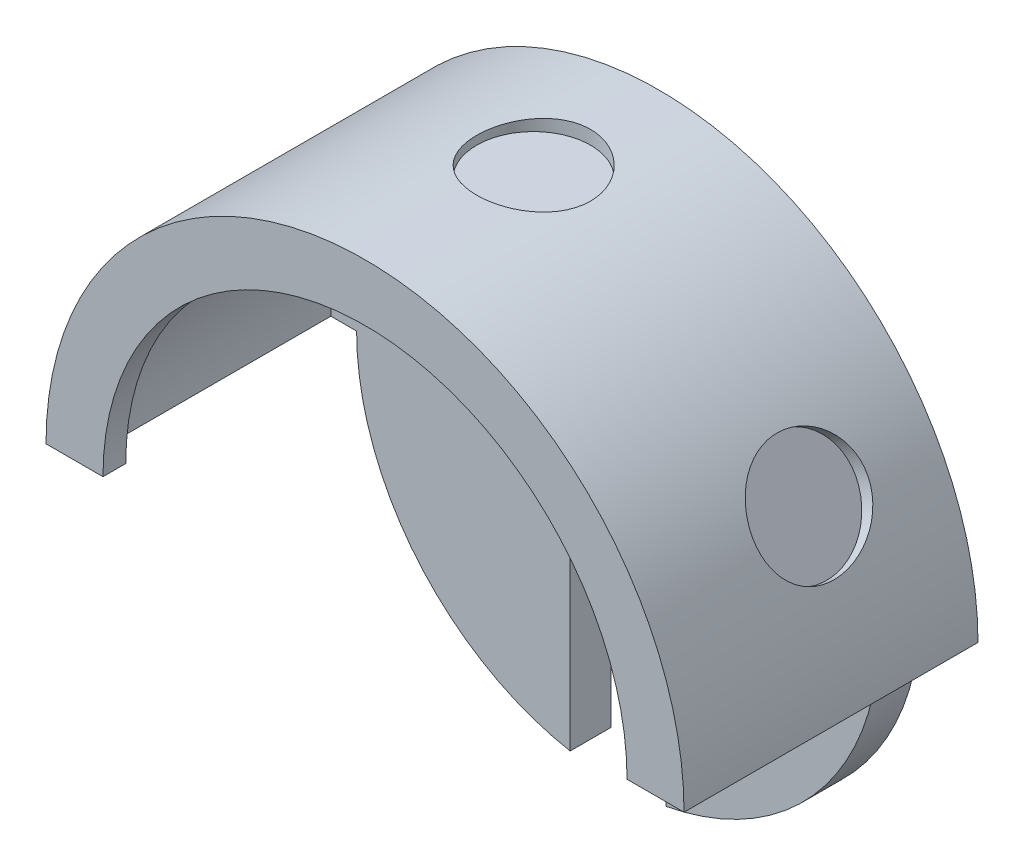
ISO-10303-21;
HEADER;
FILE_DESCRIPTION(('STEP AP214'),'2;1');
FILE_NAME('part.step','',(''),(''),'','','');
FILE_SCHEMA(('AUTOMOTIVE_DESIGN { 1 0 10303 214 1 1 1 1 }'));
ENDSEC;
DATA;
#1=APPLICATION_CONTEXT('core data for automotive mechanical design processes');
#2=APPLICATION_PROTOCOL_DEFINITION('international standard','automotive_design',2000,#1);
#3=PRODUCT_CONTEXT('',#1,'mechanical');
#4=PRODUCT('Part','Part','',(#3));
#5=PRODUCT_RELATED_PRODUCT_CATEGORY('part','',(#4));
#6=PRODUCT_DEFINITION_FORMATION('','',#4);
#7=PRODUCT_DEFINITION_CONTEXT('part definition',#1,'design');
#8=PRODUCT_DEFINITION('design','',#6,#7);
#9=PRODUCT_DEFINITION_SHAPE('','',#8);
#10=(LENGTH_UNIT() NAMED_UNIT(*) SI_UNIT(.MILLI.,.METRE.));
#11=(NAMED_UNIT(*) PLANE_ANGLE_UNIT() SI_UNIT($,.RADIAN.));
#12=(NAMED_UNIT(*) SI_UNIT($,.STERADIAN.) SOLID_ANGLE_UNIT());
#13=UNCERTAINTY_MEASURE_WITH_UNIT(LENGTH_MEASURE(1.E-05),#10,'distance_accuracy_value','');
#14=(GEOMETRIC_REPRESENTATION_CONTEXT(3) GLOBAL_UNCERTAINTY_ASSIGNED_CONTEXT((#13)) GLOBAL_UNIT_ASSIGNED_CONTEXT((#10,
#11,#12)) REPRESENTATION_CONTEXT('',''));
#15=CARTESIAN_POINT('',(0.,0.,0.));
#16=DIRECTION('',(0.,0.,1.));
#17=DIRECTION('',(1.,0.,0.));
#18=AXIS2_PLACEMENT_3D('',#15,#16,#17);
#19=CARTESIAN_POINT('',(0.,0.,12.827));
#20=DIRECTION('',(0.,0.,-1.));
#21=DIRECTION('',(-1.,0.,0.));
#22=AXIS2_PLACEMENT_3D('',#19,#20,#21);
#23=CYLINDRICAL_SURFACE('',#22,16.002);
#24=DIRECTION('',(0.,0.,1.));
#25=VECTOR('',#24,1.);
#26=CARTESIAN_POINT('',(-2.667,15.7781847815267,-2.286));
#27=LINE('',#26,#25);
#28=CARTESIAN_POINT('',(-2.667,15.7781847815267,-0.223815218473321));
#29=VERTEX_POINT('',#28);
#30=CARTESIAN_POINT('',(-2.667,15.7781847815267,0.));
#31=VERTEX_POINT('',#30);
#32=EDGE_CURVE('E243',#29,#31,#27,.T.);
#33=ORIENTED_EDGE('',*,*,#32,.F.);
#34=CARTESIAN_POINT('',(0.,0.,-16.0020000000002));
#35=DIRECTION('',(0.,0.707106781186551,-0.707106781186544));
#36=DIRECTION('',(0.,-0.707106781186544,-0.707106781186551));
#37=AXIS2_PLACEMENT_3D('',#34,#35,#36);
#38=ELLIPSE('',#37,22.6302454250944,16.002);
#39=CARTESIAN_POINT('',(2.667,15.7781847815267,-0.223815218473321));
#40=VERTEX_POINT('',#39);
#41=EDGE_CURVE('E56',#40,#29,#38,.F.);
#42=ORIENTED_EDGE('',*,*,#41,.F.);
#43=DIRECTION('',(0.,0.,1.));
#44=VECTOR('',#43,1.);
#45=CARTESIAN_POINT('',(2.667,15.7781847815267,-2.286));
#46=LINE('',#45,#44);
#47=CARTESIAN_POINT('',(2.667,15.7781847815267,0.));
#48=VERTEX_POINT('',#47);
#49=EDGE_CURVE('E250',#40,#48,#46,.T.);
#50=ORIENTED_EDGE('',*,*,#49,.T.);
#51=CARTESIAN_POINT('',(0.,0.,0.));
#52=DIRECTION('',(0.,0.,1.));
#53=DIRECTION('',(1.,0.,0.));
#54=AXIS2_PLACEMENT_3D('',#51,#52,#53);
#55=CIRCLE('',#54,16.002);
#56=CARTESIAN_POINT('',(16.002,0.,0.));
#57=VERTEX_POINT('',#56);
#58=EDGE_CURVE('E252',#57,#48,#55,.T.);
#59=ORIENTED_EDGE('',*,*,#58,.F.);
#60=DIRECTION('',(0.,0.,-1.));
#61=VECTOR('',#60,1.);
#62=CARTESIAN_POINT('',(16.002,0.,12.827));
#63=LINE('',#62,#61);
#64=CARTESIAN_POINT('',(16.002,0.,12.827));
#65=VERTEX_POINT('',#64);
#66=EDGE_CURVE('E230',#65,#57,#63,.T.);
#67=ORIENTED_EDGE('',*,*,#66,.F.);
#68=CARTESIAN_POINT('',(0.,0.,12.827));
#69=DIRECTION('',(0.,0.,1.));
#70=DIRECTION('',(1.,0.,0.));
#71=AXIS2_PLACEMENT_3D('',#68,#69,#70);
#72=CIRCLE('',#71,16.002);
#73=CARTESIAN_POINT('',(-16.002,0.,12.827));
#74=VERTEX_POINT('',#73);
#75=EDGE_CURVE('E249',#65,#74,#72,.T.);
#76=ORIENTED_EDGE('',*,*,#75,.T.);
#77=DIRECTION('',(0.,0.,-1.));
#78=VECTOR('',#77,1.);
#79=CARTESIAN_POINT('',(-16.002,0.,12.827));
#80=LINE('',#79,#78);
#81=CARTESIAN_POINT('',(-16.002,0.,0.));
#82=VERTEX_POINT('',#81);
#83=EDGE_CURVE('E227',#82,#74,#80,.F.);
#84=ORIENTED_EDGE('',*,*,#83,.F.);
#85=EDGE_CURVE('E257',#31,#82,#55,.T.);
#86=ORIENTED_EDGE('',*,*,#85,.F.);
#87=EDGE_LOOP('',(#33,#42,#50,#59,#67,#76,#84,#86));
#88=FACE_BOUND('',#87,.T.);
#89=ADVANCED_FACE('F36',(#88),#23,.F.);
#90=CARTESIAN_POINT('',(2.667,-17.5788370206905,-2.286));
#91=DIRECTION('',(-1.,0.,0.));
#92=DIRECTION('',(0.,0.,1.));
#93=AXIS2_PLACEMENT_3D('',#90,#91,#92);
#94=PLANE('',#93);
#95=DIRECTION('',(0.,0.,1.));
#96=VECTOR('',#95,1.);
#97=CARTESIAN_POINT('',(2.667,-14.3206733993203,-2.286));
#98=LINE('',#97,#96);
#99=CARTESIAN_POINT('',(2.667,-14.3206733993203,0.));
#100=VERTEX_POINT('',#99);
#101=CARTESIAN_POINT('',(2.667,-14.3206733993203,-2.286));
#102=VERTEX_POINT('',#101);
#103=EDGE_CURVE('E179',#100,#102,#98,.F.);
#104=ORIENTED_EDGE('',*,*,#103,.F.);
#105=DIRECTION('',(0.,-1.,0.));
#106=VECTOR('',#105,1.);
#107=CARTESIAN_POINT('',(2.667,-17.5788370206905,0.));
#108=LINE('',#107,#106);
#109=EDGE_CURVE('E245',#48,#100,#108,.T.);
#110=ORIENTED_EDGE('',*,*,#109,.F.);
#111=ORIENTED_EDGE('',*,*,#49,.F.);
#112=DIRECTION('',(0.,0.707106781186544,0.707106781186551));
#113=VECTOR('',#112,1.);
#114=CARTESIAN_POINT('',(2.667,16.002,0.));
#115=LINE('',#114,#113);
#116=CARTESIAN_POINT('',(2.667,13.716,-2.286));
#117=VERTEX_POINT('',#116);
#118=EDGE_CURVE('E181',#117,#40,#115,.T.);
#119=ORIENTED_EDGE('',*,*,#118,.F.);
#120=DIRECTION('',(0.,-1.,0.));
#121=VECTOR('',#120,1.);
#122=CARTESIAN_POINT('',(2.667,-17.5788370206905,-2.286));
#123=LINE('',#122,#121);
#124=EDGE_CURVE('E240',#117,#102,#123,.T.);
#125=ORIENTED_EDGE('',*,*,#124,.T.);
#126=EDGE_LOOP('',(#104,#110,#111,#119,#125));
#127=FACE_BOUND('',#126,.T.);
#128=ADVANCED_FACE('F285',(#127),#94,.T.);
#129=CARTESIAN_POINT('',(-2.667,-17.5788370206905,-2.286));
#130=DIRECTION('',(1.,0.,0.));
#131=DIRECTION('',(0.,0.,-1.));
#132=AXIS2_PLACEMENT_3D('',#129,#130,#131);
#133=PLANE('',#132);
#134=DIRECTION('',(0.,0.,1.));
#135=VECTOR('',#134,1.);
#136=CARTESIAN_POINT('',(-2.667,-14.3206733993203,-2.286));
#137=LINE('',#136,#135);
#138=CARTESIAN_POINT('',(-2.667,-14.3206733993203,-2.286));
#139=VERTEX_POINT('',#138);
#140=CARTESIAN_POINT('',(-2.667,-14.3206733993203,0.));
#141=VERTEX_POINT('',#140);
#142=EDGE_CURVE('E176',#139,#141,#137,.T.);
#143=ORIENTED_EDGE('',*,*,#142,.F.);
#144=DIRECTION('',(0.,1.,0.));
#145=VECTOR('',#144,1.);
#146=CARTESIAN_POINT('',(-2.667,-17.5788370206905,-2.286));
#147=LINE('',#146,#145);
#148=CARTESIAN_POINT('',(-2.667,13.716,-2.286));
#149=VERTEX_POINT('',#148);
#150=EDGE_CURVE('E169',#139,#149,#147,.T.);
#151=ORIENTED_EDGE('',*,*,#150,.T.);
#152=DIRECTION('',(0.,-0.707106781186544,-0.707106781186551));
#153=VECTOR('',#152,1.);
#154=CARTESIAN_POINT('',(-2.667,16.002,0.));
#155=LINE('',#154,#153);
#156=EDGE_CURVE('E185',#29,#149,#155,.T.);
#157=ORIENTED_EDGE('',*,*,#156,.F.);
#158=ORIENTED_EDGE('',*,*,#32,.T.);
#159=DIRECTION('',(0.,1.,0.));
#160=VECTOR('',#159,1.);
#161=CARTESIAN_POINT('',(-2.667,-17.5788370206905,0.));
#162=LINE('',#161,#160);
#163=EDGE_CURVE('E236',#141,#31,#162,.T.);
#164=ORIENTED_EDGE('',*,*,#163,.F.);
#165=EDGE_LOOP('',(#143,#151,#157,#158,#164));
#166=FACE_BOUND('',#165,.T.);
#167=ADVANCED_FACE('F288',(#166),#133,.T.);
#168=CARTESIAN_POINT('',(0.,0.,0.));
#169=DIRECTION('',(0.,0.,1.));
#170=DIRECTION('',(1.,0.,0.));
#171=AXIS2_PLACEMENT_3D('',#168,#169,#170);
#172=PLANE('',#171);
#173=CARTESIAN_POINT('',(0.,0.,0.));
#174=DIRECTION('',(0.,0.,-1.));
#175=DIRECTION('',(1.,0.,0.));
#176=AXIS2_PLACEMENT_3D('',#173,#174,#175);
#177=CIRCLE('',#176,14.5669);
#178=CARTESIAN_POINT('',(-14.5669,0.,0.));
#179=VERTEX_POINT('',#178);
#180=EDGE_CURVE('E162',#141,#179,#177,.T.);
#181=ORIENTED_EDGE('',*,*,#180,.F.);
#182=ORIENTED_EDGE('',*,*,#163,.T.);
#183=ORIENTED_EDGE('',*,*,#85,.T.);
#184=DIRECTION('',(-1.,0.,0.));
#185=VECTOR('',#184,1.);
#186=CARTESIAN_POINT('',(-17.78,0.,0.));
#187=LINE('',#186,#185);
#188=EDGE_CURVE('E191',#179,#82,#187,.T.);
#189=ORIENTED_EDGE('',*,*,#188,.F.);
#190=EDGE_LOOP('',(#181,#182,#183,#189));
#191=FACE_BOUND('',#190,.T.);
#192=ADVANCED_FACE('F284',(#191),#172,.T.);
#193=CARTESIAN_POINT('',(0.,0.,12.827));
#194=DIRECTION('',(0.,0.,-1.));
#195=DIRECTION('',(-1.,0.,0.));
#196=AXIS2_PLACEMENT_3D('',#193,#194,#195);
#197=CYLINDRICAL_SURFACE('',#196,17.78);
#198=CARTESIAN_POINT('',(13.562939968859,11.4967412513776,4.699));
#199=CARTESIAN_POINT('',(13.5629463220555,11.4967369141782,4.52219106607419));
#200=CARTESIAN_POINT('',(13.5726960954528,11.4852621758163,4.34529034182468));
#201=CARTESIAN_POINT('',(13.6112191852227,11.4395791530298,3.99646614292437));
#202=CARTESIAN_POINT('',(13.6400092606519,11.4053508410323,3.8245471924492));
#203=CARTESIAN_POINT('',(13.7151290040725,11.3149046715869,3.49078466099217));
#204=CARTESIAN_POINT('',(13.7614430776876,11.2587063634784,3.32893227058305));
#205=CARTESIAN_POINT('',(13.8693837074108,11.1254623988938,3.0195887184785));
#206=CARTESIAN_POINT('',(13.9310088360396,11.0484186858157,2.87209621976571));
#207=CARTESIAN_POINT('',(14.0674882618575,10.874121331483,2.59397890172139));
#208=CARTESIAN_POINT('',(14.1424701231093,10.7766710620912,2.46353988232701));
#209=CARTESIAN_POINT('',(14.3020050234222,10.5640279342218,2.22484882826454));
#210=CARTESIAN_POINT('',(14.3865586627227,10.4488339628857,2.11659818621152));
#211=CARTESIAN_POINT('',(14.5624150235298,10.2023287912792,1.92465107796087));
#212=CARTESIAN_POINT('',(14.6537602079893,10.0709120749901,1.8411288156555));
#213=CARTESIAN_POINT('',(14.8391317549793,9.79571631718528,1.70213052678938));
#214=CARTESIAN_POINT('',(14.9331579170059,9.65193819853687,1.64665240865619));
#215=CARTESIAN_POINT('',(15.1194901198206,9.35732137882578,1.56588905764258));
#216=CARTESIAN_POINT('',(15.2118038385715,9.20657332087026,1.54029103035473));
#217=CARTESIAN_POINT('',(15.392713572103,8.90080401715823,1.51904074239715));
#218=CARTESIAN_POINT('',(15.4813098746876,8.74578310375338,1.52338615917365));
#219=CARTESIAN_POINT('',(15.6512913137051,8.43777726335801,1.56165772782985));
#220=CARTESIAN_POINT('',(15.7327469575274,8.28478921920104,1.59524715697017));
#221=CARTESIAN_POINT('',(15.8877006894275,7.98361238056094,1.69052174964671));
#222=CARTESIAN_POINT('',(15.9611985078257,7.83542374884238,1.75220786497169));
#223=CARTESIAN_POINT('',(16.0993166713135,7.54758530045987,1.9022517021137));
#224=CARTESIAN_POINT('',(16.1638890854866,7.40798366339983,1.99074585604436));
#225=CARTESIAN_POINT('',(16.2829564839689,7.14247380731139,2.1917934814523));
#226=CARTESIAN_POINT('',(16.3374505346907,7.01656685730518,2.30434917973872));
#227=CARTESIAN_POINT('',(16.4367135356616,6.78081599270072,2.55218579222501));
#228=CARTESIAN_POINT('',(16.4813365817216,6.67122002278822,2.68776118255397));
#229=CARTESIAN_POINT('',(16.559822569897,6.47394646298769,2.97680279437975));
#230=CARTESIAN_POINT('',(16.593685382105,6.38626913772391,3.13026923184276));
#231=CARTESIAN_POINT('',(16.6507890635919,6.23587485350969,3.45109679082958));
#232=CARTESIAN_POINT('',(16.6740147029666,6.17319369962289,3.61847743187279));
#233=CARTESIAN_POINT('',(16.7099053447133,6.07537692370397,3.96217878176246));
#234=CARTESIAN_POINT('',(16.7225714244932,6.04023849146811,4.13849857658564));
#235=CARTESIAN_POINT('',(16.7373417469991,5.99918884017318,4.49248796121029));
#236=CARTESIAN_POINT('',(16.7395881934301,5.99288412485848,4.6701060356264));
#237=CARTESIAN_POINT('',(16.7339245571801,6.00868011582599,5.02390452801016));
#238=CARTESIAN_POINT('',(16.7260149277422,6.03077955449417,5.20008500978125));
#239=CARTESIAN_POINT('',(16.7000742097978,6.10224007668725,5.5446734194809));
#240=CARTESIAN_POINT('',(16.6821183534393,6.15139848274315,5.71312916631082));
#241=CARTESIAN_POINT('',(16.6360216136523,6.27499074216549,6.0390116864991));
#242=CARTESIAN_POINT('',(16.6078800411576,6.34942630551656,6.19643771283406));
#243=CARTESIAN_POINT('',(16.5409401114158,6.52183325827911,6.49761480061399));
#244=CARTESIAN_POINT('',(16.5020327324106,6.62004406531448,6.64120453375608));
#245=CARTESIAN_POINT('',(16.4136559672437,6.83621980830631,6.90895780406048));
#246=CARTESIAN_POINT('',(16.3641857233624,6.95418634828849,7.03311976224022));
#247=CARTESIAN_POINT('',(16.2541961524756,7.20754962019968,7.26001635968968));
#248=CARTESIAN_POINT('',(16.1935509648211,7.34313911246273,7.36247501291127));
#249=CARTESIAN_POINT('',(16.0621731811674,7.62622492980434,7.54111529927604));
#250=CARTESIAN_POINT('',(15.9914409473863,7.77372082725046,7.61729787563745));
#251=CARTESIAN_POINT('',(15.8413317435089,8.07519660372851,7.74080305856789));
#252=CARTESIAN_POINT('',(15.7619987861328,8.22914120788826,7.7882651150547));
#253=CARTESIAN_POINT('',(15.5960873189821,8.53940183648166,7.85342890001966));
#254=CARTESIAN_POINT('',(15.5095094985302,8.69571763414869,7.87113345644502));
#255=CARTESIAN_POINT('',(15.3326536697481,9.00384668382842,7.87618875222254));
#256=CARTESIAN_POINT('',(15.2424437558895,9.15569231773974,7.86395766694282));
#257=CARTESIAN_POINT('',(15.0599543673045,9.45286130645684,7.81039971224177));
#258=CARTESIAN_POINT('',(14.9676749085886,9.59818471169393,7.7690730678349));
#259=CARTESIAN_POINT('',(14.7842892128013,9.87831987472592,7.65866650004679));
#260=CARTESIAN_POINT('',(14.6931814604767,10.0131466591805,7.58962715532578));
#261=CARTESIAN_POINT('',(14.5152873359346,10.2693322470816,7.42580341974971));
#262=CARTESIAN_POINT('',(14.4285012168957,10.3906902619841,7.33101752265322));
#263=CARTESIAN_POINT('',(14.2614908981178,10.6187827581055,7.11693269433483));
#264=CARTESIAN_POINT('',(14.1813672071383,10.7253055415175,6.9973297710897));
#265=CARTESIAN_POINT('',(14.0322914313865,10.9196261111387,6.73764035760564));
#266=CARTESIAN_POINT('',(13.9633419711942,11.0074194997543,6.59754906975958));
#267=CARTESIAN_POINT('',(13.8391854048681,11.1631256599036,6.29947792529654));
#268=CARTESIAN_POINT('',(13.7840966161487,11.2308680823858,6.14135976117309));
#269=CARTESIAN_POINT('',(13.6911134524486,11.344039040171,5.81269466407738));
#270=CARTESIAN_POINT('',(13.6532024274871,11.3894891863655,5.6421599531001));
#271=CARTESIAN_POINT('',(13.6043773774917,11.447719997524,5.342373446279));
#272=CARTESIAN_POINT('',(13.588879378431,11.4660811197454,5.21490465029244));
#273=CARTESIAN_POINT('',(13.5681584650576,11.4905931951952,4.95797362230078));
#274=CARTESIAN_POINT('',(13.5629353151824,11.4967444283489,4.82851143606497));
#275=CARTESIAN_POINT('',(13.562939968859,11.4967412513776,4.699));
#276=B_SPLINE_CURVE_WITH_KNOTS('',3,(#198,#199,#200,#201,#202,#203,#204,#205,#206,#207,#208,
#209,#210,#211,#212,#213,#214,#215,#216,#217,#218,#219,#220,#221,#222,#223,#224,#225,#226,#227,
#228,#229,#230,#231,#232,#233,#234,#235,#236,#237,#238,#239,#240,#241,#242,#243,#244,#245,#246,
#247,#248,#249,#250,#251,#252,#253,#254,#255,#256,#257,#258,#259,#260,#261,#262,#263,#264,#265,
#266,#267,#268,#269,#270,#271,#272,#273,#274,#275),.UNSPECIFIED.,.T.,.F.,(4,2,2,2,2,2,2,2,2,2,2,
2,2,2,2,2,2,2,2,2,2,2,2,2,2,2,2,2,2,2,2,2,2,2,2,2,2,2,4),(0.,0.529953011731834,1.06037310397786,
1.5903222882437,2.12022208284523,2.65548429430672,3.19078009029396,3.72976174645318,
4.26870319865562,4.80195075299997,5.33515694663193,5.86230367555467,6.38946826315472,
6.91936211297752,7.44930502381111,7.98662340471654,8.52394827236487,9.06204007483377,
9.60007696825919,10.1307488748959,10.6613970996515,11.188123699062,11.7148859383138,
12.2471911201095,12.7795395422921,13.3182974920718,13.8570361003332,14.3931374723811,
14.9291878941773,15.4577929951955,15.9863940082191,16.514223817872,17.0420845136184,
17.5768395208844,18.1117199488192,18.6510221304755,19.1898004557669,19.5779966156584,
19.966183875614),.UNSPECIFIED.);
#277=CARTESIAN_POINT('',(13.562939968859,11.4967412513776,4.699));
#278=VERTEX_POINT('',#277);
#279=EDGE_CURVE('E11',#278,#278,#276,.T.);
#280=ORIENTED_EDGE('',*,*,#279,.T.);
#281=EDGE_LOOP('',(#280));
#282=FACE_BOUND('',#281,.T.);
#283=CARTESIAN_POINT('',(-16.737939968859,5.99747993734643,4.699));
#284=CARTESIAN_POINT('',(-16.7379393893324,5.99748760797568,4.52219106607419));
#285=CARTESIAN_POINT('',(-16.7328768611079,6.01166852859986,4.34529034182468));
#286=CARTESIAN_POINT('',(-16.7125757477381,6.06787201436606,3.99646614292437));
#287=CARTESIAN_POINT('',(-16.6973281977342,6.10991910706341,3.8245471924492));
#288=CARTESIAN_POINT('',(-16.6565593890298,6.22019779791405,3.49078466099217));
#289=CARTESIAN_POINT('',(-16.6310472633656,6.28840611627174,3.32893227058305));
#290=CARTESIAN_POINT('',(-16.569624919996,6.44850742600489,3.0195887184785));
#291=CARTESIAN_POINT('',(-16.5337156715828,6.54039820944789,2.87209621976571));
#292=CARTESIAN_POINT('',(-16.4510094478273,6.74574153646652,2.59397890172139));
#293=CARTESIAN_POINT('',(-16.4041059695543,6.85940286782946,2.46353988232701));
#294=CARTESIAN_POINT('',(-16.2997190690356,7.10388570822534,2.22484882826454));
#295=CARTESIAN_POINT('',(-16.242234983146,7.23470829351007,2.11659818621152));
#296=CARTESIAN_POINT('',(-16.1166834227741,7.51025695518932,1.92465107796087));
#297=CARTESIAN_POINT('',(-16.0485458002155,7.65507256358921,1.8411288156555));
#298=CARTESIAN_POINT('',(-15.9029050564378,7.95320691132374,1.70213052678938));
#299=CARTESIAN_POINT('',(-15.8254026341933,8.10652501558334,1.64665240865619));
#300=CARTESIAN_POINT('',(-15.6634230853487,8.41520184661957,1.56588905764258));
#301=CARTESIAN_POINT('',(-15.5790282969635,8.57052190115341,1.54029103035473));
#302=CARTESIAN_POINT('',(-15.4046791790171,8.88007897803958,1.51904074239715));
#303=CARTESIAN_POINT('',(-15.3147252811829,9.0343160834616,1.52338615917365));
#304=CARTESIAN_POINT('',(-15.1329751183953,9.33552724802031,1.56165772782985));
#305=CARTESIAN_POINT('',(-15.0412114075913,9.48256392693053,1.59524715697017));
#306=CARTESIAN_POINT('',(-14.8578614802475,9.76734621448726,1.69052174964671));
#307=CARTESIAN_POINT('',(-14.7662752698263,9.90509150820212,1.75220786497169));
#308=CARTESIAN_POINT('',(-14.586058943085,10.1686245706979,1.9022517021137));
#309=CARTESIAN_POINT('',(-14.4974465860677,10.2943467402855,1.99074585604436));
#310=CARTESIAN_POINT('',(-14.3270420049811,10.5302170601779,2.1917934814523));
#311=CARTESIAN_POINT('',(-14.2452504131236,10.6403637674612,2.30434917973871));
#312=CARTESIAN_POINT('',(-14.0907156758974,10.8442034802601,2.55218579222501));
#313=CARTESIAN_POINT('',(-14.0181143048308,10.9376461566986,2.68776118255397));
#314=CARTESIAN_POINT('',(-13.8865133846362,11.1042537961998,2.97680279437975));
#315=CARTESIAN_POINT('',(-13.827513999726,11.1774185144475,3.13026923184276));
#316=CARTESIAN_POINT('',(-13.7258205697559,11.3020688953718,3.45109679082958));
#317=CARTESIAN_POINT('',(-13.6831499178388,11.3535234660328,3.61847743187279));
#318=CARTESIAN_POINT('',(-13.6163834258501,11.4335140615031,3.96217878176246));
#319=CARTESIAN_POINT('',(-13.5922856907746,11.4620524244768,4.13849857658564));
#320=CARTESIAN_POINT('',(-13.5641208111896,11.4953687246364,4.49248796121029));
#321=CARTESIAN_POINT('',(-13.559783990779,11.5004665619712,4.6701060356264));
#322=CARTESIAN_POINT('',(-13.5706319021098,11.4876637136172,5.02390452801016));
#323=CARTESIAN_POINT('',(-13.5858157626869,11.4697640542554,5.20008500978125));
#324=CARTESIAN_POINT('',(-13.6347320313016,11.4115684724266,5.5446734194809));
#325=CARTESIAN_POINT('',(-13.6683265315763,11.3714390416455,5.71312916631082));
#326=CARTESIAN_POINT('',(-13.7523121980536,11.2697219642471,6.0390116864991));
#327=CARTESIAN_POINT('',(-13.8027045006133,11.2081328658887,6.19643771283406));
#328=CARTESIAN_POINT('',(-13.9185433366239,11.0639577098235,6.49761480061399));
#329=CARTESIAN_POINT('',(-13.9841427009401,10.9811575276927,6.64120453375608));
#330=CARTESIAN_POINT('',(-14.1271680034695,10.796533132458,6.90895780406048));
#331=CARTESIAN_POINT('',(-14.20459490195,10.6947073745342,7.03311976224023));
#332=CARTESIAN_POINT('',(-14.3690191463676,10.4727719760393,7.26001635968968));
#333=CARTESIAN_POINT('',(-14.4561204973264,10.3524569567817,7.36247501291127));
#334=CARTESIAN_POINT('',(-14.6355911147685,10.0971375499739,7.54111529927604));
#335=CARTESIAN_POINT('',(-14.7279601920202,9.96213368992995,7.61729787563745));
#336=CARTESIAN_POINT('',(-14.9139912711371,9.68139741779123,7.74080305856789));
#337=CARTESIAN_POINT('',(-15.007644730427,9.5357207592663,7.7882651150547));
#338=CARTESIAN_POINT('',(-15.1933825830076,9.23690689963795,7.85342890001966));
#339=CARTESIAN_POINT('',(-15.2854671245742,9.08377040888884,7.87113345644502));
#340=CARTESIAN_POINT('',(-15.4638867948497,8.77654424351634,7.87618875222254));
#341=CARTESIAN_POINT('',(-15.5502840143414,8.62249734948589,7.86395766694282));
#342=CARTESIAN_POINT('',(-15.7163952134948,8.31587240869164,7.81039971224177));
#343=CARTESIAN_POINT('',(-15.7961092448367,8.16329435057764,7.7690730678349));
#344=CARTESIAN_POINT('',(-15.947020564622,7.8644100978192,7.65866650004679));
#345=CARTESIAN_POINT('',(-16.018230108908,7.71809507759711,7.58962715532578));
#346=CARTESIAN_POINT('',(-16.1511462738427,7.43594145260913,7.42580341974971));
#347=CARTESIAN_POINT('',(-16.2128523381817,7.30010346137429,7.33101752265322));
#348=CARTESIAN_POINT('',(-16.3268810748464,7.04142203455781,7.11693269433483));
#349=CARTESIAN_POINT('',(-16.3790706658733,6.91877149101857,6.9973297710897));
#350=CARTESIAN_POINT('',(-16.4728193277673,6.69250779731809,6.73764035760564));
#351=CARTESIAN_POINT('',(-16.5143759024965,6.58889911890644,6.59754906975958));
#352=CARTESIAN_POINT('',(-16.5871431095485,6.40352329834683,6.29947792529654));
#353=CARTESIAN_POINT('',(-16.6182653739723,6.32194379661103,6.14135976117309));
#354=CARTESIAN_POINT('',(-16.6697827165348,6.18483253582989,5.81269466407738));
#355=CARTESIAN_POINT('',(-16.6901881852642,6.12927555203247,5.6421599531001));
#356=CARTESIAN_POINT('',(-16.7162050220127,6.05787641281614,5.342373446279));
#357=CARTESIAN_POINT('',(-16.7243572207682,6.03527419081102,5.21490465029244));
#358=CARTESIAN_POINT('',(-16.7352248441204,6.00507331571511,4.95797362230078));
#359=CARTESIAN_POINT('',(-16.7379403933586,5.99747431865858,4.82851143606497));
#360=CARTESIAN_POINT('',(-16.737939968859,5.99747993734643,4.699));
#361=B_SPLINE_CURVE_WITH_KNOTS('',3,(#283,#284,#285,#286,#287,#288,#289,#290,#291,#292,#293,
#294,#295,#296,#297,#298,#299,#300,#301,#302,#303,#304,#305,#306,#307,#308,#309,#310,#311,#312,
#313,#314,#315,#316,#317,#318,#319,#320,#321,#322,#323,#324,#325,#326,#327,#328,#329,#330,#331,
#332,#333,#334,#335,#336,#337,#338,#339,#340,#341,#342,#343,#344,#345,#346,#347,#348,#349,#350,
#351,#352,#353,#354,#355,#356,#357,#358,#359,#360),.UNSPECIFIED.,.T.,.F.,(4,2,2,2,2,2,2,2,2,2,2,
2,2,2,2,2,2,2,2,2,2,2,2,2,2,2,2,2,2,2,2,2,2,2,2,2,2,2,4),(0.,0.529953011731834,1.06037310397786,
1.5903222882437,2.12022208284523,2.65548429430672,3.19078009029396,3.72976174645318,
4.26870319865562,4.80195075299997,5.33515694663193,5.86230367555467,6.38946826315472,
6.91936211297751,7.44930502381111,7.98662340471654,8.52394827236487,9.06204007483377,
9.60007696825919,10.1307488748959,10.6613970996515,11.188123699062,11.7148859383138,
12.2471911201095,12.7795395422921,13.3182974920718,13.8570361003332,14.3931374723811,
14.9291878941773,15.4577929951955,15.9863940082191,16.514223817872,17.0420845136184,
17.5768395208844,18.1117199488192,18.6510221304755,19.1898004557669,19.5779966156584,
19.966183875614),.UNSPECIFIED.);
#362=CARTESIAN_POINT('',(-16.737939968859,5.99747993734643,4.699));
#363=VERTEX_POINT('',#362);
#364=EDGE_CURVE('E49',#363,#363,#361,.T.);
#365=ORIENTED_EDGE('',*,*,#364,.T.);
#366=EDGE_LOOP('',(#365));
#367=FACE_BOUND('',#366,.T.);
#368=CARTESIAN_POINT('',(0.,17.78,7.874));
#369=CARTESIAN_POINT('',(-0.176834272803559,17.779996860499,7.87399308789527));
#370=CARTESIAN_POINT('',(-0.353760276474435,17.7773345475861,7.85917668388805));
#371=CARTESIAN_POINT('',(-0.702636976170341,17.7669705515331,7.80033470869449));
#372=CARTESIAN_POINT('',(-0.874583168419531,17.7592644467676,7.75628350843591));
#373=CARTESIAN_POINT('',(-1.20840336932425,17.7396759189355,7.6403552637877));
#374=CARTESIAN_POINT('',(-1.37028595669797,17.7277971119787,7.56850230725213));
#375=CARTESIAN_POINT('',(-1.67968033886533,17.7011642838946,7.39907627596433));
#376=CARTESIAN_POINT('',(-1.82719350611337,17.6864105377636,7.30150566086668));
#377=CARTESIAN_POINT('',(-2.10528845292541,17.6554794523429,7.08228299946773));
#378=CARTESIAN_POINT('',(-2.23569075378987,17.6392896140689,6.96040501506395));
#379=CARTESIAN_POINT('',(-2.47431066385718,17.6074050773695,6.69651346808736));
#380=CARTESIAN_POINT('',(-2.58252676763105,17.5917104126049,6.55449854024155));
#381=CARTESIAN_POINT('',(-2.77443697751256,17.562471990081,6.25311155126589));
#382=CARTESIAN_POINT('',(-2.8579507476004,17.5489443655014,6.09362295760655));
#383=CARTESIAN_POINT('',(-2.99693175274534,17.5257466659067,5.76259812849609));
#384=CARTESIAN_POINT('',(-3.05240117248445,17.5160762904206,5.59106283268074));
#385=CARTESIAN_POINT('',(-3.13314749362602,17.501813245162,5.24272659680314));
#386=CARTESIAN_POINT('',(-3.15873604426167,17.497168200817,5.06600008497016));
#387=CARTESIAN_POINT('',(-3.17996113556506,17.4933236242031,4.71070568905069));
#388=CARTESIAN_POINT('',(-3.17560011030028,17.4941236494014,4.53213795578204));
#389=CARTESIAN_POINT('',(-3.13730305321407,17.5010310732679,4.18047310025559));
#390=CARTESIAN_POINT('',(-3.10371949225693,17.5070752169228,4.00733616837714));
#391=CARTESIAN_POINT('',(-3.00848490740359,17.5236906529416,3.66919429164684));
#392=CARTESIAN_POINT('',(-2.94683279194658,17.5342621213681,3.50418966332957));
#393=CARTESIAN_POINT('',(-2.79686090101402,17.5588081719177,3.18595441183607));
#394=CARTESIAN_POINT('',(-2.70839702002572,17.5728010626423,3.03279317035672));
#395=CARTESIAN_POINT('',(-2.50741485062002,17.6026009470443,2.74335557218635));
#396=CARTESIAN_POINT('',(-2.39489434127196,17.6184081081543,2.60708077630404));
#397=CARTESIAN_POINT('',(-2.14708370311366,17.6503321237352,2.35324622341009));
#398=CARTESIAN_POINT('',(-2.0114916736261,17.6664501794594,2.23598115416595));
#399=CARTESIAN_POINT('',(-1.72240194178151,17.6969721447264,2.02582001120683));
#400=CARTESIAN_POINT('',(-1.56890409013977,17.7113760399758,1.9329241406841));
#401=CARTESIAN_POINT('',(-1.24806598927107,17.7368718650097,1.77410233990572));
#402=CARTESIAN_POINT('',(-1.08071128369948,17.7479602788378,1.70820501348167));
#403=CARTESIAN_POINT('',(-0.737066599315645,17.7655481873625,1.60553795961619));
#404=CARTESIAN_POINT('',(-0.560777481903322,17.7720481235526,1.56876542980745));
#405=CARTESIAN_POINT('',(-0.206805511434775,17.7796666330683,1.5257972455228));
#406=CARTESIAN_POINT('',(-0.0291731916629405,17.7808563219156,1.51919748414399));
#407=CARTESIAN_POINT('',(0.324657672071492,17.7779159983157,1.5356811294994));
#408=CARTESIAN_POINT('',(0.500856279332502,17.7737862220195,1.55876321854541));
#409=CARTESIAN_POINT('',(0.845551153547647,17.7607151559893,1.63361928608268));
#410=CARTESIAN_POINT('',(1.01409280314533,17.7518078422684,1.68519073580659));
#411=CARTESIAN_POINT('',(1.34013786670227,17.7301762899918,1.81534388033548));
#412=CARTESIAN_POINT('',(1.49764058613055,17.7174518115388,1.89392727280437));
#413=CARTESIAN_POINT('',(1.79887511638303,17.6894202201271,2.07678175309869));
#414=CARTESIAN_POINT('',(1.94245322523381,17.674088519897,2.18130220525555));
#415=CARTESIAN_POINT('',(2.21017671996063,17.642610993999,2.41272396684813));
#416=CARTESIAN_POINT('',(2.3343204692598,17.6264650999187,2.53962715923366));
#417=CARTESIAN_POINT('',(2.56117025556791,17.5949456219001,2.81403421094439));
#418=CARTESIAN_POINT('',(2.66360169744518,17.5795836053268,2.96176662010127));
#419=CARTESIAN_POINT('',(2.84219430388297,17.5515964263823,3.27257878559997));
#420=CARTESIAN_POINT('',(2.91835638540425,17.5389711684872,3.43565800599158));
#421=CARTESIAN_POINT('',(3.04184946870733,17.5179760176208,3.77180624204766));
#422=CARTESIAN_POINT('',(3.08931110514287,17.5095868725541,3.944826007739));
#423=CARTESIAN_POINT('',(3.15446277782144,17.4979678518596,4.29654626483573));
#424=CARTESIAN_POINT('',(3.17215582770847,17.4947374539841,4.47524617934078));
#425=CARTESIAN_POINT('',(3.17717461821268,17.4938264351138,4.83050749530486));
#426=CARTESIAN_POINT('',(3.16493306604874,17.4960667340823,5.00706272797015));
#427=CARTESIAN_POINT('',(3.11137231728735,17.5056702342996,5.35555674888295));
#428=CARTESIAN_POINT('',(3.07005325740941,17.513033411461,5.52749555883247));
#429=CARTESIAN_POINT('',(2.95968564608994,17.5320211446814,5.86167214256239));
#430=CARTESIAN_POINT('',(2.89067972173689,17.5436391475629,6.02392439076834));
#431=CARTESIAN_POINT('',(2.72694316252054,17.5698328135793,6.33461831808467));
#432=CARTESIAN_POINT('',(2.63221094657221,17.5844086584831,6.48305914762057));
#433=CARTESIAN_POINT('',(2.41818880634554,17.6151234916105,6.76409245018533));
#434=CARTESIAN_POINT('',(2.29858241267489,17.6312810429656,6.89644192431391));
#435=CARTESIAN_POINT('',(2.03887069652061,17.6631958692855,7.13933777357711));
#436=CARTESIAN_POINT('',(1.89876066530988,17.678953051326,7.24987912667615));
#437=CARTESIAN_POINT('',(1.60067084818535,17.7084399042084,7.44684536509181));
#438=CARTESIAN_POINT('',(1.44255621784164,17.7221522219042,7.53306882942732));
#439=CARTESIAN_POINT('',(1.11389774704191,17.7458353632889,7.67759348818177));
#440=CARTESIAN_POINT('',(0.943366078664813,17.7558097936918,7.73592161410194));
#441=CARTESIAN_POINT('',(0.643549329474524,17.7687960264401,7.81079287901303));
#442=CARTESIAN_POINT('',(0.516045281943024,17.7729743564266,7.83445618390963));
#443=CARTESIAN_POINT('',(0.259043871089454,17.7785774635059,7.86606210681271));
#444=CARTESIAN_POINT('',(0.129546550799271,17.7800022999587,7.87400506372047));
#445=CARTESIAN_POINT('',(0.,17.78,7.874));
#446=B_SPLINE_CURVE_WITH_KNOTS('',3,(#368,#369,#370,#371,#372,#373,#374,#375,#376,#377,#378,
#379,#380,#381,#382,#383,#384,#385,#386,#387,#388,#389,#390,#391,#392,#393,#394,#395,#396,#397,
#398,#399,#400,#401,#402,#403,#404,#405,#406,#407,#408,#409,#410,#411,#412,#413,#414,#415,#416,
#417,#418,#419,#420,#421,#422,#423,#424,#425,#426,#427,#428,#429,#430,#431,#432,#433,#434,#435,
#436,#437,#438,#439,#440,#441,#442,#443,#444,#445),.UNSPECIFIED.,.T.,.F.,(4,2,2,2,2,2,2,2,2,2,2,
2,2,2,2,2,2,2,2,2,2,2,2,2,2,2,2,2,2,2,2,2,2,2,2,2,2,2,4),(0.,0.530029161861871,1.06052359570501,
1.59055942681236,2.12054458331056,2.65570711922064,3.19090595620276,3.72992061316059,
4.26889327388297,4.80219291983708,5.33544922387646,5.86236138201784,6.3892940330495,
6.91911058891781,7.44897607908879,7.98639979922173,8.5238280002924,9.06182412086932,
9.59976846954942,10.1304865540945,10.6611810788947,11.1881505998446,11.7151532461708,
12.2474334741993,12.7797585017209,13.3184597838791,13.8571422601766,14.3933540108814,
14.9295114745416,15.457964668885,15.9864153785116,16.5140555809928,17.0417282184986,
17.5765773534238,18.1115495115155,18.6508306756596,19.1895901355017,19.5778911642396,
19.9661838218428),.UNSPECIFIED.);
#447=CARTESIAN_POINT('',(0.,17.78,7.874));
#448=VERTEX_POINT('',#447);
#449=EDGE_CURVE('E248',#448,#448,#446,.T.);
#450=ORIENTED_EDGE('',*,*,#449,.T.);
#451=EDGE_LOOP('',(#450));
#452=FACE_BOUND('',#451,.T.);
#453=CARTESIAN_POINT('',(0.,0.,-2.286));
#454=DIRECTION('',(0.,0.,1.));
#455=DIRECTION('',(1.,0.,0.));
#456=AXIS2_PLACEMENT_3D('',#453,#454,#455);
#457=CIRCLE('',#456,17.78);
#458=CARTESIAN_POINT('',(17.78,0.,-2.286));
#459=VERTEX_POINT('',#458);
#460=CARTESIAN_POINT('',(-17.78,0.,-2.286));
#461=VERTEX_POINT('',#460);
#462=EDGE_CURVE('E237',#459,#461,#457,.T.);
#463=ORIENTED_EDGE('',*,*,#462,.T.);
#464=DIRECTION('',(0.,0.,1.));
#465=VECTOR('',#464,1.);
#466=CARTESIAN_POINT('',(-17.78,0.,-39.7572886399463));
#467=LINE('',#466,#465);
#468=CARTESIAN_POINT('',(-17.78,0.,14.097));
#469=VERTEX_POINT('',#468);
#470=EDGE_CURVE('E148',#461,#469,#467,.T.);
#471=ORIENTED_EDGE('',*,*,#470,.T.);
#472=CARTESIAN_POINT('',(0.,0.,14.097));
#473=DIRECTION('',(0.,0.,1.));
#474=DIRECTION('',(1.,0.,0.));
#475=AXIS2_PLACEMENT_3D('',#472,#473,#474);
#476=CIRCLE('',#475,17.78);
#477=CARTESIAN_POINT('',(17.78,0.,14.097));
#478=VERTEX_POINT('',#477);
#479=EDGE_CURVE('E208',#478,#469,#476,.T.);
#480=ORIENTED_EDGE('',*,*,#479,.F.);
#481=DIRECTION('',(0.,0.,1.));
#482=VECTOR('',#481,1.);
#483=CARTESIAN_POINT('',(17.78,0.,-39.7572886399463));
#484=LINE('',#483,#482);
#485=EDGE_CURVE('E225',#459,#478,#484,.T.);
#486=ORIENTED_EDGE('',*,*,#485,.F.);
#487=EDGE_LOOP('',(#463,#471,#480,#486));
#488=FACE_BOUND('',#487,.T.);
#489=ADVANCED_FACE('F38',(#282,#367,#452,#488),#197,.T.);
#490=CARTESIAN_POINT('',(0.,0.,-2.286));
#491=DIRECTION('',(0.,0.,1.));
#492=DIRECTION('',(1.,0.,0.));
#493=AXIS2_PLACEMENT_3D('',#490,#491,#492);
#494=PLANE('',#493);
#495=DIRECTION('',(-1.,0.,0.));
#496=VECTOR('',#495,1.);
#497=CARTESIAN_POINT('',(17.782,15.7781847815267,-2.286));
#498=LINE('',#497,#496);
#499=CARTESIAN_POINT('',(2.667,15.7781847815267,-2.286));
#500=VERTEX_POINT('',#499);
#501=CARTESIAN_POINT('',(-2.667,15.7781847815267,-2.286));
#502=VERTEX_POINT('',#501);
#503=EDGE_CURVE('E184',#500,#502,#498,.T.);
#504=ORIENTED_EDGE('',*,*,#503,.F.);
#505=ORIENTED_EDGE('',*,*,#503,.T.);
#506=EDGE_LOOP('',(#504,#505));
#507=FACE_BOUND('',#506,.T.);
#508=DIRECTION('',(-1.,0.,0.));
#509=VECTOR('',#508,1.);
#510=CARTESIAN_POINT('',(15.875,0.,-2.286));
#511=LINE('',#510,#509);
#512=CARTESIAN_POINT('',(14.5669,0.,-2.286));
#513=VERTEX_POINT('',#512);
#514=EDGE_CURVE('E154',#459,#513,#511,.T.);
#515=ORIENTED_EDGE('',*,*,#514,.T.);
#516=CARTESIAN_POINT('',(0.,0.,-2.286));
#517=DIRECTION('',(0.,0.,-1.));
#518=DIRECTION('',(1.,0.,0.));
#519=AXIS2_PLACEMENT_3D('',#516,#517,#518);
#520=CIRCLE('',#519,14.5669);
#521=EDGE_CURVE('E164',#513,#102,#520,.T.);
#522=ORIENTED_EDGE('',*,*,#521,.T.);
#523=ORIENTED_EDGE('',*,*,#124,.F.);
#524=DIRECTION('',(-1.,0.,0.));
#525=VECTOR('',#524,1.);
#526=CARTESIAN_POINT('',(17.782,13.716,-2.286));
#527=LINE('',#526,#525);
#528=EDGE_CURVE('E188',#117,#149,#527,.T.);
#529=ORIENTED_EDGE('',*,*,#528,.T.);
#530=ORIENTED_EDGE('',*,*,#150,.F.);
#531=CARTESIAN_POINT('',(-14.5669,0.,-2.286));
#532=VERTEX_POINT('',#531);
#533=EDGE_CURVE('E159',#139,#532,#520,.T.);
#534=ORIENTED_EDGE('',*,*,#533,.T.);
#535=DIRECTION('',(-1.,0.,0.));
#536=VECTOR('',#535,1.);
#537=CARTESIAN_POINT('',(-17.78,0.,-2.286));
#538=LINE('',#537,#536);
#539=EDGE_CURVE('E142',#532,#461,#538,.T.);
#540=ORIENTED_EDGE('',*,*,#539,.T.);
#541=ORIENTED_EDGE('',*,*,#462,.F.);
#542=EDGE_LOOP('',(#515,#522,#523,#529,#530,#534,#540,#541));
#543=FACE_BOUND('',#542,.T.);
#544=ADVANCED_FACE('F167',(#507,#543),#494,.F.);
#545=CARTESIAN_POINT('',(14.5669,0.,0.));
#546=VERTEX_POINT('',#545);
#547=EDGE_CURVE('E170',#546,#100,#177,.T.);
#548=ORIENTED_EDGE('',*,*,#547,.F.);
#549=DIRECTION('',(-1.,0.,0.));
#550=VECTOR('',#549,1.);
#551=CARTESIAN_POINT('',(15.875,0.,0.));
#552=LINE('',#551,#550);
#553=EDGE_CURVE('E187',#57,#546,#552,.T.);
#554=ORIENTED_EDGE('',*,*,#553,.F.);
#555=ORIENTED_EDGE('',*,*,#58,.T.);
#556=ORIENTED_EDGE('',*,*,#109,.T.);
#557=EDGE_LOOP('',(#548,#554,#555,#556));
#558=FACE_BOUND('',#557,.T.);
#559=ADVANCED_FACE('F275',(#558),#172,.T.);
#560=CARTESIAN_POINT('',(0.,17.018,4.699));
#561=DIRECTION('',(0.,1.,0.));
#562=DIRECTION('',(0.,0.,1.));
#563=AXIS2_PLACEMENT_3D('',#560,#561,#562);
#564=CYLINDRICAL_SURFACE('',#563,3.175);
#565=CARTESIAN_POINT('',(0.,17.018,4.699));
#566=DIRECTION('',(0.,1.,0.));
#567=DIRECTION('',(0.,0.,1.));
#568=AXIS2_PLACEMENT_3D('',#565,#566,#567);
#569=CIRCLE('',#568,3.175);
#570=CARTESIAN_POINT('',(0.,17.018,7.874));
#571=VERTEX_POINT('',#570);
#572=EDGE_CURVE('E233',#571,#571,#569,.T.);
#573=ORIENTED_EDGE('',*,*,#572,.F.);
#574=EDGE_LOOP('',(#573));
#575=FACE_BOUND('',#574,.T.);
#576=ORIENTED_EDGE('',*,*,#449,.F.);
#577=EDGE_LOOP('',(#576));
#578=FACE_BOUND('',#577,.T.);
#579=ADVANCED_FACE('F269',(#575,#578),#564,.F.);
#580=CARTESIAN_POINT('',(0.,17.018,4.699));
#581=DIRECTION('',(0.,1.,0.));
#582=DIRECTION('',(0.,0.,1.));
#583=AXIS2_PLACEMENT_3D('',#580,#581,#582);
#584=PLANE('',#583);
#585=ORIENTED_EDGE('',*,*,#572,.T.);
#586=EDGE_LOOP('',(#585));
#587=FACE_BOUND('',#586,.T.);
#588=ADVANCED_FACE('F274',(#587),#584,.T.);
#589=CARTESIAN_POINT('',(17.78,0.,-39.7572886399463));
#590=DIRECTION('',(0.,1.,0.));
#591=DIRECTION('',(0.,0.,1.));
#592=AXIS2_PLACEMENT_3D('',#589,#590,#591);
#593=PLANE('',#592);
#594=ORIENTED_EDGE('',*,*,#83,.T.);
#595=DIRECTION('',(1.,0.,0.));
#596=VECTOR('',#595,1.);
#597=CARTESIAN_POINT('',(-17.78,0.,12.827));
#598=LINE('',#597,#596);
#599=CARTESIAN_POINT('',(-14.605,0.,12.827));
#600=VERTEX_POINT('',#599);
#601=EDGE_CURVE('E205',#74,#600,#598,.T.);
#602=ORIENTED_EDGE('',*,*,#601,.T.);
#603=DIRECTION('',(0.,0.,-1.));
#604=VECTOR('',#603,1.);
#605=CARTESIAN_POINT('',(-14.605,0.,14.097));
#606=LINE('',#605,#604);
#607=CARTESIAN_POINT('',(-14.605,0.,14.097));
#608=VERTEX_POINT('',#607);
#609=EDGE_CURVE('E213',#608,#600,#606,.T.);
#610=ORIENTED_EDGE('',*,*,#609,.F.);
#611=DIRECTION('',(1.,0.,0.));
#612=VECTOR('',#611,1.);
#613=CARTESIAN_POINT('',(-17.78,0.,14.097));
#614=LINE('',#613,#612);
#615=EDGE_CURVE('E211',#469,#608,#614,.T.);
#616=ORIENTED_EDGE('',*,*,#615,.F.);
#617=ORIENTED_EDGE('',*,*,#470,.F.);
#618=ORIENTED_EDGE('',*,*,#539,.F.);
#619=DIRECTION('',(0.,0.,1.));
#620=VECTOR('',#619,1.);
#621=CARTESIAN_POINT('',(-14.5669,0.,-2.286));
#622=LINE('',#621,#620);
#623=EDGE_CURVE('E146',#532,#179,#622,.T.);
#624=ORIENTED_EDGE('',*,*,#623,.T.);
#625=ORIENTED_EDGE('',*,*,#188,.T.);
#626=EDGE_LOOP('',(#594,#602,#610,#616,#617,#618,#624,#625));
#627=FACE_BOUND('',#626,.T.);
#628=ADVANCED_FACE('F145',(#627),#593,.F.);
#629=ORIENTED_EDGE('',*,*,#66,.T.);
#630=ORIENTED_EDGE('',*,*,#553,.T.);
#631=DIRECTION('',(0.,0.,1.));
#632=VECTOR('',#631,1.);
#633=CARTESIAN_POINT('',(14.5669,0.,-2.286));
#634=LINE('',#633,#632);
#635=EDGE_CURVE('E163',#513,#546,#634,.T.);
#636=ORIENTED_EDGE('',*,*,#635,.F.);
#637=ORIENTED_EDGE('',*,*,#514,.F.);
#638=ORIENTED_EDGE('',*,*,#485,.T.);
#639=DIRECTION('',(1.,0.,0.));
#640=VECTOR('',#639,1.);
#641=CARTESIAN_POINT('',(14.605,0.,14.097));
#642=LINE('',#641,#640);
#643=CARTESIAN_POINT('',(14.605,0.,14.097));
#644=VERTEX_POINT('',#643);
#645=EDGE_CURVE('E204',#644,#478,#642,.T.);
#646=ORIENTED_EDGE('',*,*,#645,.F.);
#647=DIRECTION('',(0.,0.,-1.));
#648=VECTOR('',#647,1.);
#649=CARTESIAN_POINT('',(14.605,0.,14.097));
#650=LINE('',#649,#648);
#651=CARTESIAN_POINT('',(14.605,0.,12.827));
#652=VERTEX_POINT('',#651);
#653=EDGE_CURVE('E222',#644,#652,#650,.T.);
#654=ORIENTED_EDGE('',*,*,#653,.T.);
#655=DIRECTION('',(1.,0.,0.));
#656=VECTOR('',#655,1.);
#657=CARTESIAN_POINT('',(14.605,0.,12.827));
#658=LINE('',#657,#656);
#659=EDGE_CURVE('E216',#652,#65,#658,.T.);
#660=ORIENTED_EDGE('',*,*,#659,.T.);
#661=EDGE_LOOP('',(#629,#630,#636,#637,#638,#646,#654,#660));
#662=FACE_BOUND('',#661,.T.);
#663=ADVANCED_FACE('F311',(#662),#593,.F.);
#664=CARTESIAN_POINT('',(0.,0.,12.827));
#665=DIRECTION('',(0.,0.,1.));
#666=DIRECTION('',(1.,0.,0.));
#667=AXIS2_PLACEMENT_3D('',#664,#665,#666);
#668=PLANE('',#667);
#669=ORIENTED_EDGE('',*,*,#75,.F.);
#670=ORIENTED_EDGE('',*,*,#659,.F.);
#671=CARTESIAN_POINT('',(0.,0.,12.827));
#672=DIRECTION('',(0.,0.,-1.));
#673=DIRECTION('',(1.,0.,0.));
#674=AXIS2_PLACEMENT_3D('',#671,#672,#673);
#675=CIRCLE('',#674,14.605);
#676=EDGE_CURVE('E200',#600,#652,#675,.T.);
#677=ORIENTED_EDGE('',*,*,#676,.F.);
#678=ORIENTED_EDGE('',*,*,#601,.F.);
#679=EDGE_LOOP('',(#669,#670,#677,#678));
#680=FACE_BOUND('',#679,.T.);
#681=ADVANCED_FACE('F315',(#680),#668,.F.);
#682=CARTESIAN_POINT('',(0.,0.,14.097));
#683=DIRECTION('',(0.,0.,-1.));
#684=DIRECTION('',(-1.,0.,0.));
#685=AXIS2_PLACEMENT_3D('',#682,#683,#684);
#686=CYLINDRICAL_SURFACE('',#685,14.605);
#687=ORIENTED_EDGE('',*,*,#676,.T.);
#688=ORIENTED_EDGE('',*,*,#653,.F.);
#689=CARTESIAN_POINT('',(0.,0.,14.097));
#690=DIRECTION('',(0.,0.,-1.));
#691=DIRECTION('',(1.,0.,0.));
#692=AXIS2_PLACEMENT_3D('',#689,#690,#691);
#693=CIRCLE('',#692,14.605);
#694=EDGE_CURVE('E201',#608,#644,#693,.T.);
#695=ORIENTED_EDGE('',*,*,#694,.F.);
#696=ORIENTED_EDGE('',*,*,#609,.T.);
#697=EDGE_LOOP('',(#687,#688,#695,#696));
#698=FACE_BOUND('',#697,.T.);
#699=ADVANCED_FACE('F363',(#698),#686,.F.);
#700=CARTESIAN_POINT('',(0.,0.,14.097));
#701=DIRECTION('',(0.,0.,1.));
#702=DIRECTION('',(1.,0.,0.));
#703=AXIS2_PLACEMENT_3D('',#700,#701,#702);
#704=PLANE('',#703);
#705=ORIENTED_EDGE('',*,*,#694,.T.);
#706=ORIENTED_EDGE('',*,*,#645,.T.);
#707=ORIENTED_EDGE('',*,*,#479,.T.);
#708=ORIENTED_EDGE('',*,*,#615,.T.);
#709=EDGE_LOOP('',(#705,#706,#707,#708));
#710=FACE_BOUND('',#709,.T.);
#711=ADVANCED_FACE('F359',(#710),#704,.T.);
#712=CARTESIAN_POINT('',(-14.7380203216036,8.50900000000001,4.699));
#713=DIRECTION('',(-0.866025403784438,0.500000000000001,0.));
#714=DIRECTION('',(-0.500000000000001,-0.866025403784438,0.));
#715=AXIS2_PLACEMENT_3D('',#712,#713,#714);
#716=CYLINDRICAL_SURFACE('',#715,3.175);
#717=CARTESIAN_POINT('',(-14.7380203216036,8.50900000000001,4.699));
#718=DIRECTION('',(-0.866025403784438,0.500000000000001,0.));
#719=DIRECTION('',(-0.500000000000001,-0.866025403784438,0.));
#720=AXIS2_PLACEMENT_3D('',#717,#718,#719);
#721=CIRCLE('',#720,3.175);
#722=CARTESIAN_POINT('',(-16.3255203216036,5.75936934298442,4.699));
#723=VERTEX_POINT('',#722);
#724=EDGE_CURVE('E197',#723,#723,#721,.T.);
#725=ORIENTED_EDGE('',*,*,#724,.F.);
#726=EDGE_LOOP('',(#725));
#727=FACE_BOUND('',#726,.T.);
#728=ORIENTED_EDGE('',*,*,#364,.F.);
#729=EDGE_LOOP('',(#728));
#730=FACE_BOUND('',#729,.T.);
#731=ADVANCED_FACE('F354',(#727,#730),#716,.F.);
#732=CARTESIAN_POINT('',(-14.7380203216036,8.50900000000001,4.699));
#733=DIRECTION('',(-0.866025403784438,0.500000000000001,0.));
#734=DIRECTION('',(-0.500000000000001,-0.866025403784438,0.));
#735=AXIS2_PLACEMENT_3D('',#732,#733,#734);
#736=PLANE('',#735);
#737=ORIENTED_EDGE('',*,*,#724,.T.);
#738=EDGE_LOOP('',(#737));
#739=FACE_BOUND('',#738,.T.);
#740=ADVANCED_FACE('F351',(#739),#736,.T.);
#741=CARTESIAN_POINT('',(14.7380203216036,8.50899999999997,4.699));
#742=DIRECTION('',(0.86602540378444,0.499999999999998,0.));
#743=DIRECTION('',(-0.499999999999998,0.86602540378444,0.));
#744=AXIS2_PLACEMENT_3D('',#741,#742,#743);
#745=CYLINDRICAL_SURFACE('',#744,3.175);
#746=CARTESIAN_POINT('',(14.7380203216036,8.50899999999997,4.699));
#747=DIRECTION('',(0.86602540378444,0.499999999999998,0.));
#748=DIRECTION('',(-0.499999999999998,0.86602540378444,0.));
#749=AXIS2_PLACEMENT_3D('',#746,#747,#748);
#750=CIRCLE('',#749,3.175);
#751=CARTESIAN_POINT('',(13.1505203216036,11.2586306570156,4.699));
#752=VERTEX_POINT('',#751);
#753=EDGE_CURVE('E153',#752,#752,#750,.T.);
#754=ORIENTED_EDGE('',*,*,#753,.F.);
#755=EDGE_LOOP('',(#754));
#756=FACE_BOUND('',#755,.T.);
#757=ORIENTED_EDGE('',*,*,#279,.F.);
#758=EDGE_LOOP('',(#757));
#759=FACE_BOUND('',#758,.T.);
#760=ADVANCED_FACE('F346',(#756,#759),#745,.F.);
#761=CARTESIAN_POINT('',(14.7380203216036,8.50899999999997,4.699));
#762=DIRECTION('',(0.86602540378444,0.499999999999998,0.));
#763=DIRECTION('',(-0.499999999999998,0.86602540378444,0.));
#764=AXIS2_PLACEMENT_3D('',#761,#762,#763);
#765=PLANE('',#764);
#766=ORIENTED_EDGE('',*,*,#753,.T.);
#767=EDGE_LOOP('',(#766));
#768=FACE_BOUND('',#767,.T.);
#769=ADVANCED_FACE('F344',(#768),#765,.T.);
#770=CARTESIAN_POINT('',(17.782,16.002,0.));
#771=DIRECTION('',(0.,0.707106781186551,-0.707106781186544));
#772=DIRECTION('',(0.,0.707106781186544,0.707106781186551));
#773=AXIS2_PLACEMENT_3D('',#770,#771,#772);
#774=PLANE('',#773);
#775=ORIENTED_EDGE('',*,*,#528,.F.);
#776=ORIENTED_EDGE('',*,*,#118,.T.);
#777=ORIENTED_EDGE('',*,*,#41,.T.);
#778=ORIENTED_EDGE('',*,*,#156,.T.);
#779=EDGE_LOOP('',(#775,#776,#777,#778));
#780=FACE_BOUND('',#779,.T.);
#781=ADVANCED_FACE('F301',(#780),#774,.F.);
#782=CARTESIAN_POINT('',(0.,0.,-2.286));
#783=DIRECTION('',(0.,0.,1.));
#784=DIRECTION('',(1.,0.,0.));
#785=AXIS2_PLACEMENT_3D('',#782,#783,#784);
#786=CYLINDRICAL_SURFACE('',#785,14.5669);
#787=ORIENTED_EDGE('',*,*,#142,.T.);
#788=ORIENTED_EDGE('',*,*,#180,.T.);
#789=ORIENTED_EDGE('',*,*,#623,.F.);
#790=ORIENTED_EDGE('',*,*,#533,.F.);
#791=EDGE_LOOP('',(#787,#788,#789,#790));
#792=FACE_BOUND('',#791,.T.);
#793=ADVANCED_FACE('F158',(#792),#786,.T.);
#794=ORIENTED_EDGE('',*,*,#103,.T.);
#795=ORIENTED_EDGE('',*,*,#521,.F.);
#796=ORIENTED_EDGE('',*,*,#635,.T.);
#797=ORIENTED_EDGE('',*,*,#547,.T.);
#798=EDGE_LOOP('',(#794,#795,#796,#797));
#799=FACE_BOUND('',#798,.T.);
#800=ADVANCED_FACE('F335',(#799),#786,.T.);
#801=CLOSED_SHELL('',(#89,#128,#167,#192,#489,#544,#559,#579,#588,#628,#663,#681,#699,#711,#731,
#740,#760,#769,#781,#793,#800));
#802=MANIFOLD_SOLID_BREP('B2',#801);
#803=ADVANCED_BREP_SHAPE_REPRESENTATION('',(#18,#802),#14);
#804=SHAPE_DEFINITION_REPRESENTATION(#9,#803);
ENDSEC;
END-ISO-10303-21;
